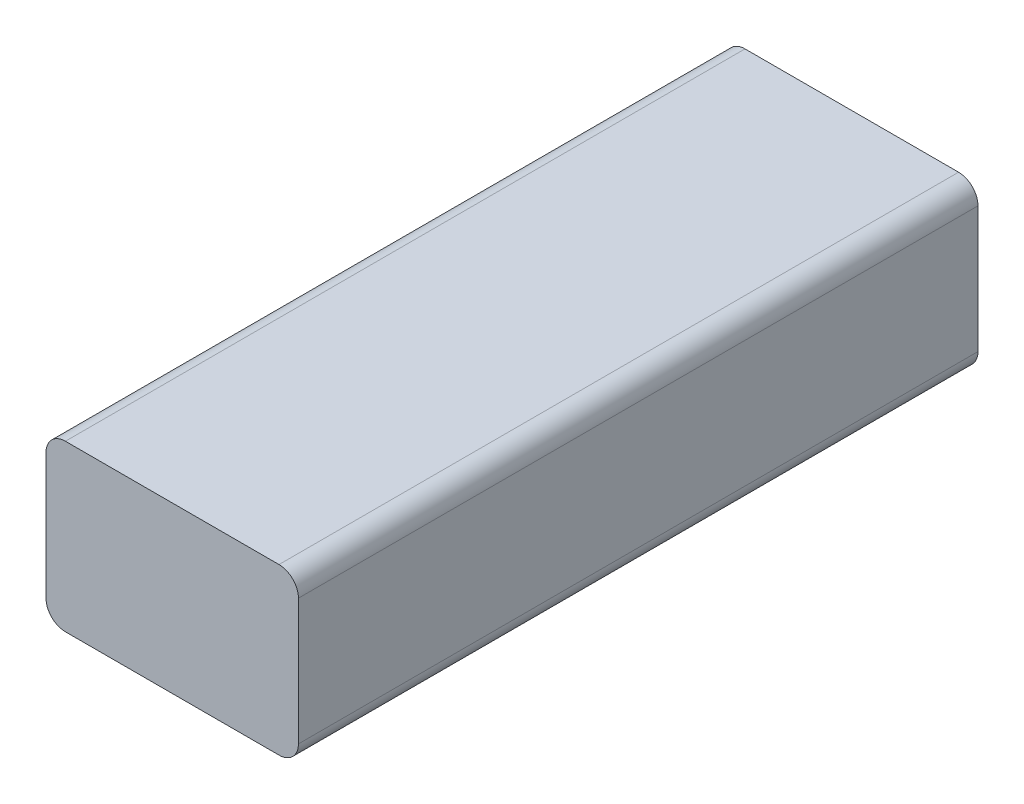
ISO-10303-21;
HEADER;
FILE_DESCRIPTION(('STEP AP214'),'2;1');
FILE_NAME('part.step','',(''),(''),'','','');
FILE_SCHEMA(('AUTOMOTIVE_DESIGN { 1 0 10303 214 1 1 1 1 }'));
ENDSEC;
DATA;
#1=APPLICATION_CONTEXT('core data for automotive mechanical design processes');
#2=APPLICATION_PROTOCOL_DEFINITION('international standard','automotive_design',2000,#1);
#3=PRODUCT_CONTEXT('',#1,'mechanical');
#4=PRODUCT('Part','Part','',(#3));
#5=PRODUCT_RELATED_PRODUCT_CATEGORY('part','',(#4));
#6=PRODUCT_DEFINITION_FORMATION('','',#4);
#7=PRODUCT_DEFINITION_CONTEXT('part definition',#1,'design');
#8=PRODUCT_DEFINITION('design','',#6,#7);
#9=PRODUCT_DEFINITION_SHAPE('','',#8);
#10=(LENGTH_UNIT() NAMED_UNIT(*) SI_UNIT(.MILLI.,.METRE.));
#11=(NAMED_UNIT(*) PLANE_ANGLE_UNIT() SI_UNIT($,.RADIAN.));
#12=(NAMED_UNIT(*) SI_UNIT($,.STERADIAN.) SOLID_ANGLE_UNIT());
#13=UNCERTAINTY_MEASURE_WITH_UNIT(LENGTH_MEASURE(1.E-05),#10,'distance_accuracy_value','');
#14=(GEOMETRIC_REPRESENTATION_CONTEXT(3) GLOBAL_UNCERTAINTY_ASSIGNED_CONTEXT((#13)) GLOBAL_UNIT_ASSIGNED_CONTEXT((#10,
#11,#12)) REPRESENTATION_CONTEXT('',''));
#15=CARTESIAN_POINT('',(0.,0.,0.));
#16=DIRECTION('',(0.,0.,1.));
#17=DIRECTION('',(1.,0.,0.));
#18=AXIS2_PLACEMENT_3D('',#15,#16,#17);
#19=CARTESIAN_POINT('',(14.6935895524748,-7.88477366255144,70.));
#20=DIRECTION('',(0.,0.,-1.));
#21=DIRECTION('',(-1.,0.,0.));
#22=AXIS2_PLACEMENT_3D('',#19,#20,#21);
#23=CYLINDRICAL_SURFACE('',#22,2.);
#24=CARTESIAN_POINT('',(14.6935895524748,-7.88477366255144,0.));
#25=DIRECTION('',(0.,0.,1.));
#26=DIRECTION('',(1.,0.,0.));
#27=AXIS2_PLACEMENT_3D('',#24,#25,#26);
#28=CIRCLE('',#27,2.);
#29=CARTESIAN_POINT('',(14.6935895524748,-9.88477366255144,0.));
#30=VERTEX_POINT('',#29);
#31=CARTESIAN_POINT('',(16.6935895524748,-7.88477366255143,0.));
#32=VERTEX_POINT('',#31);
#33=EDGE_CURVE('E132',#30,#32,#28,.T.);
#34=ORIENTED_EDGE('',*,*,#33,.T.);
#35=DIRECTION('',(0.,0.,-1.));
#36=VECTOR('',#35,1.);
#37=CARTESIAN_POINT('',(16.6935895524748,-7.88477366255143,70.));
#38=LINE('',#37,#36);
#39=CARTESIAN_POINT('',(16.6935895524748,-7.88477366255143,70.));
#40=VERTEX_POINT('',#39);
#41=EDGE_CURVE('E11',#40,#32,#38,.T.);
#42=ORIENTED_EDGE('',*,*,#41,.F.);
#43=CARTESIAN_POINT('',(14.6935895524748,-7.88477366255144,70.));
#44=DIRECTION('',(0.,0.,1.));
#45=DIRECTION('',(1.,0.,0.));
#46=AXIS2_PLACEMENT_3D('',#43,#44,#45);
#47=CIRCLE('',#46,2.);
#48=CARTESIAN_POINT('',(14.6935895524748,-9.88477366255144,70.));
#49=VERTEX_POINT('',#48);
#50=EDGE_CURVE('E146',#49,#40,#47,.T.);
#51=ORIENTED_EDGE('',*,*,#50,.F.);
#52=DIRECTION('',(0.,0.,-1.));
#53=VECTOR('',#52,1.);
#54=CARTESIAN_POINT('',(14.6935895524748,-9.88477366255144,70.));
#55=LINE('',#54,#53);
#56=EDGE_CURVE('E128',#49,#30,#55,.T.);
#57=ORIENTED_EDGE('',*,*,#56,.T.);
#58=EDGE_LOOP('',(#34,#42,#51,#57));
#59=FACE_BOUND('',#58,.T.);
#60=ADVANCED_FACE('F36',(#59),#23,.T.);
#61=CARTESIAN_POINT('',(16.6935895524748,5.11522633744855,70.));
#62=DIRECTION('',(-1.,0.,0.));
#63=DIRECTION('',(0.,-1.,0.));
#64=AXIS2_PLACEMENT_3D('',#61,#62,#63);
#65=PLANE('',#64);
#66=DIRECTION('',(0.,1.,0.));
#67=VECTOR('',#66,1.);
#68=CARTESIAN_POINT('',(16.6935895524748,5.11522633744855,0.));
#69=LINE('',#68,#67);
#70=CARTESIAN_POINT('',(16.6935895524748,5.11522633744855,0.));
#71=VERTEX_POINT('',#70);
#72=EDGE_CURVE('E135',#32,#71,#69,.T.);
#73=ORIENTED_EDGE('',*,*,#72,.T.);
#74=DIRECTION('',(0.,0.,-1.));
#75=VECTOR('',#74,1.);
#76=CARTESIAN_POINT('',(16.6935895524748,5.11522633744855,70.));
#77=LINE('',#76,#75);
#78=CARTESIAN_POINT('',(16.6935895524748,5.11522633744855,70.));
#79=VERTEX_POINT('',#78);
#80=EDGE_CURVE('E44',#79,#71,#77,.T.);
#81=ORIENTED_EDGE('',*,*,#80,.F.);
#82=DIRECTION('',(0.,1.,0.));
#83=VECTOR('',#82,1.);
#84=CARTESIAN_POINT('',(16.6935895524748,5.11522633744855,70.));
#85=LINE('',#84,#83);
#86=EDGE_CURVE('E95',#40,#79,#85,.T.);
#87=ORIENTED_EDGE('',*,*,#86,.F.);
#88=ORIENTED_EDGE('',*,*,#41,.T.);
#89=EDGE_LOOP('',(#73,#81,#87,#88));
#90=FACE_BOUND('',#89,.T.);
#91=ADVANCED_FACE('F181',(#90),#65,.F.);
#92=CARTESIAN_POINT('',(14.6935895524748,5.11522633744856,70.));
#93=DIRECTION('',(0.,0.,-1.));
#94=DIRECTION('',(-1.,0.,0.));
#95=AXIS2_PLACEMENT_3D('',#92,#93,#94);
#96=CYLINDRICAL_SURFACE('',#95,2.);
#97=CARTESIAN_POINT('',(14.6935895524748,5.11522633744856,0.));
#98=DIRECTION('',(0.,0.,1.));
#99=DIRECTION('',(-1.,0.,0.));
#100=AXIS2_PLACEMENT_3D('',#97,#98,#99);
#101=CIRCLE('',#100,2.);
#102=CARTESIAN_POINT('',(14.6935895524748,7.11522633744856,0.));
#103=VERTEX_POINT('',#102);
#104=EDGE_CURVE('E137',#71,#103,#101,.T.);
#105=ORIENTED_EDGE('',*,*,#104,.T.);
#106=DIRECTION('',(0.,0.,-1.));
#107=VECTOR('',#106,1.);
#108=CARTESIAN_POINT('',(14.6935895524748,7.11522633744856,70.));
#109=LINE('',#108,#107);
#110=CARTESIAN_POINT('',(14.6935895524748,7.11522633744856,70.));
#111=VERTEX_POINT('',#110);
#112=EDGE_CURVE('E153',#111,#103,#109,.T.);
#113=ORIENTED_EDGE('',*,*,#112,.F.);
#114=CARTESIAN_POINT('',(14.6935895524748,5.11522633744856,70.));
#115=DIRECTION('',(0.,0.,1.));
#116=DIRECTION('',(-1.,0.,0.));
#117=AXIS2_PLACEMENT_3D('',#114,#115,#116);
#118=CIRCLE('',#117,2.);
#119=EDGE_CURVE('E161',#79,#111,#118,.T.);
#120=ORIENTED_EDGE('',*,*,#119,.F.);
#121=ORIENTED_EDGE('',*,*,#80,.T.);
#122=EDGE_LOOP('',(#105,#113,#120,#121));
#123=FACE_BOUND('',#122,.T.);
#124=ADVANCED_FACE('F159',(#123),#96,.T.);
#125=CARTESIAN_POINT('',(-7.30641044752521,7.11522633744856,70.));
#126=DIRECTION('',(0.,-1.,0.));
#127=DIRECTION('',(0.,0.,-1.));
#128=AXIS2_PLACEMENT_3D('',#125,#126,#127);
#129=PLANE('',#128);
#130=DIRECTION('',(-1.,0.,0.));
#131=VECTOR('',#130,1.);
#132=CARTESIAN_POINT('',(-7.30641044752521,7.11522633744856,0.));
#133=LINE('',#132,#131);
#134=CARTESIAN_POINT('',(-7.30641044752521,7.11522633744856,0.));
#135=VERTEX_POINT('',#134);
#136=EDGE_CURVE('E139',#103,#135,#133,.T.);
#137=ORIENTED_EDGE('',*,*,#136,.T.);
#138=DIRECTION('',(0.,0.,-1.));
#139=VECTOR('',#138,1.);
#140=CARTESIAN_POINT('',(-7.30641044752521,7.11522633744856,70.));
#141=LINE('',#140,#139);
#142=CARTESIAN_POINT('',(-7.30641044752521,7.11522633744856,70.));
#143=VERTEX_POINT('',#142);
#144=EDGE_CURVE('E150',#143,#135,#141,.T.);
#145=ORIENTED_EDGE('',*,*,#144,.F.);
#146=DIRECTION('',(-1.,0.,0.));
#147=VECTOR('',#146,1.);
#148=CARTESIAN_POINT('',(-7.30641044752521,7.11522633744856,70.));
#149=LINE('',#148,#147);
#150=EDGE_CURVE('E173',#111,#143,#149,.T.);
#151=ORIENTED_EDGE('',*,*,#150,.F.);
#152=ORIENTED_EDGE('',*,*,#112,.T.);
#153=EDGE_LOOP('',(#137,#145,#151,#152));
#154=FACE_BOUND('',#153,.T.);
#155=ADVANCED_FACE('F169',(#154),#129,.F.);
#156=CARTESIAN_POINT('',(-7.30641044752522,5.11522633744856,70.));
#157=DIRECTION('',(0.,0.,-1.));
#158=DIRECTION('',(-1.,0.,0.));
#159=AXIS2_PLACEMENT_3D('',#156,#157,#158);
#160=CYLINDRICAL_SURFACE('',#159,2.);
#161=CARTESIAN_POINT('',(-7.30641044752522,5.11522633744856,0.));
#162=DIRECTION('',(0.,0.,1.));
#163=DIRECTION('',(1.,0.,0.));
#164=AXIS2_PLACEMENT_3D('',#161,#162,#163);
#165=CIRCLE('',#164,2.);
#166=CARTESIAN_POINT('',(-9.30641044752522,5.11522633744855,0.));
#167=VERTEX_POINT('',#166);
#168=EDGE_CURVE('E141',#135,#167,#165,.T.);
#169=ORIENTED_EDGE('',*,*,#168,.T.);
#170=DIRECTION('',(0.,0.,-1.));
#171=VECTOR('',#170,1.);
#172=CARTESIAN_POINT('',(-9.30641044752522,5.11522633744855,70.));
#173=LINE('',#172,#171);
#174=CARTESIAN_POINT('',(-9.30641044752522,5.11522633744855,70.));
#175=VERTEX_POINT('',#174);
#176=EDGE_CURVE('E123',#175,#167,#173,.T.);
#177=ORIENTED_EDGE('',*,*,#176,.F.);
#178=CARTESIAN_POINT('',(-7.30641044752522,5.11522633744856,70.));
#179=DIRECTION('',(0.,0.,1.));
#180=DIRECTION('',(1.,0.,0.));
#181=AXIS2_PLACEMENT_3D('',#178,#179,#180);
#182=CIRCLE('',#181,2.);
#183=EDGE_CURVE('E114',#143,#175,#182,.T.);
#184=ORIENTED_EDGE('',*,*,#183,.F.);
#185=ORIENTED_EDGE('',*,*,#144,.T.);
#186=EDGE_LOOP('',(#169,#177,#184,#185));
#187=FACE_BOUND('',#186,.T.);
#188=ADVANCED_FACE('F172',(#187),#160,.T.);
#189=CARTESIAN_POINT('',(-9.30641044752522,5.11522633744855,70.));
#190=DIRECTION('',(1.,0.,0.));
#191=DIRECTION('',(0.,1.,0.));
#192=AXIS2_PLACEMENT_3D('',#189,#190,#191);
#193=PLANE('',#192);
#194=DIRECTION('',(0.,-1.,0.));
#195=VECTOR('',#194,1.);
#196=CARTESIAN_POINT('',(-9.30641044752522,5.11522633744855,0.));
#197=LINE('',#196,#195);
#198=CARTESIAN_POINT('',(-9.30641044752523,-7.88477366255143,0.));
#199=VERTEX_POINT('',#198);
#200=EDGE_CURVE('E122',#167,#199,#197,.T.);
#201=ORIENTED_EDGE('',*,*,#200,.T.);
#202=DIRECTION('',(0.,0.,-1.));
#203=VECTOR('',#202,1.);
#204=CARTESIAN_POINT('',(-9.30641044752523,-7.88477366255143,70.));
#205=LINE('',#204,#203);
#206=CARTESIAN_POINT('',(-9.30641044752523,-7.88477366255143,70.));
#207=VERTEX_POINT('',#206);
#208=EDGE_CURVE('E119',#207,#199,#205,.T.);
#209=ORIENTED_EDGE('',*,*,#208,.F.);
#210=DIRECTION('',(0.,-1.,0.));
#211=VECTOR('',#210,1.);
#212=CARTESIAN_POINT('',(-9.30641044752522,5.11522633744855,70.));
#213=LINE('',#212,#211);
#214=EDGE_CURVE('E108',#175,#207,#213,.T.);
#215=ORIENTED_EDGE('',*,*,#214,.F.);
#216=ORIENTED_EDGE('',*,*,#176,.T.);
#217=EDGE_LOOP('',(#201,#209,#215,#216));
#218=FACE_BOUND('',#217,.T.);
#219=ADVANCED_FACE('F120',(#218),#193,.F.);
#220=CARTESIAN_POINT('',(-7.30641044752522,-7.88477366255144,70.));
#221=DIRECTION('',(0.,0.,-1.));
#222=DIRECTION('',(-1.,0.,0.));
#223=AXIS2_PLACEMENT_3D('',#220,#221,#222);
#224=CYLINDRICAL_SURFACE('',#223,2.);
#225=CARTESIAN_POINT('',(-7.30641044752522,-7.88477366255144,0.));
#226=DIRECTION('',(0.,0.,1.));
#227=DIRECTION('',(1.,0.,0.));
#228=AXIS2_PLACEMENT_3D('',#225,#226,#227);
#229=CIRCLE('',#228,2.);
#230=CARTESIAN_POINT('',(-7.30641044752521,-9.88477366255144,0.));
#231=VERTEX_POINT('',#230);
#232=EDGE_CURVE('E81',#199,#231,#229,.T.);
#233=ORIENTED_EDGE('',*,*,#232,.T.);
#234=DIRECTION('',(0.,0.,-1.));
#235=VECTOR('',#234,1.);
#236=CARTESIAN_POINT('',(-7.30641044752521,-9.88477366255144,70.));
#237=LINE('',#236,#235);
#238=CARTESIAN_POINT('',(-7.30641044752521,-9.88477366255144,70.));
#239=VERTEX_POINT('',#238);
#240=EDGE_CURVE('E124',#239,#231,#237,.T.);
#241=ORIENTED_EDGE('',*,*,#240,.F.);
#242=CARTESIAN_POINT('',(-7.30641044752522,-7.88477366255144,70.));
#243=DIRECTION('',(0.,0.,1.));
#244=DIRECTION('',(1.,0.,0.));
#245=AXIS2_PLACEMENT_3D('',#242,#243,#244);
#246=CIRCLE('',#245,2.);
#247=EDGE_CURVE('E112',#207,#239,#246,.T.);
#248=ORIENTED_EDGE('',*,*,#247,.F.);
#249=ORIENTED_EDGE('',*,*,#208,.T.);
#250=EDGE_LOOP('',(#233,#241,#248,#249));
#251=FACE_BOUND('',#250,.T.);
#252=ADVANCED_FACE('F126',(#251),#224,.T.);
#253=CARTESIAN_POINT('',(-7.30641044752521,-9.88477366255144,70.));
#254=DIRECTION('',(0.,1.,0.));
#255=DIRECTION('',(0.,0.,1.));
#256=AXIS2_PLACEMENT_3D('',#253,#254,#255);
#257=PLANE('',#256);
#258=DIRECTION('',(1.,0.,0.));
#259=VECTOR('',#258,1.);
#260=CARTESIAN_POINT('',(-7.30641044752521,-9.88477366255144,0.));
#261=LINE('',#260,#259);
#262=EDGE_CURVE('E87',#231,#30,#261,.T.);
#263=ORIENTED_EDGE('',*,*,#262,.T.);
#264=ORIENTED_EDGE('',*,*,#56,.F.);
#265=DIRECTION('',(1.,0.,0.));
#266=VECTOR('',#265,1.);
#267=CARTESIAN_POINT('',(-7.30641044752521,-9.88477366255144,70.));
#268=LINE('',#267,#266);
#269=EDGE_CURVE('E52',#239,#49,#268,.T.);
#270=ORIENTED_EDGE('',*,*,#269,.F.);
#271=ORIENTED_EDGE('',*,*,#240,.T.);
#272=EDGE_LOOP('',(#263,#264,#270,#271));
#273=FACE_BOUND('',#272,.T.);
#274=ADVANCED_FACE('F197',(#273),#257,.F.);
#275=CARTESIAN_POINT('',(14.6935895524748,-7.88477366255144,70.));
#276=DIRECTION('',(0.,0.,1.));
#277=DIRECTION('',(1.,0.,0.));
#278=AXIS2_PLACEMENT_3D('',#275,#276,#277);
#279=PLANE('',#278);
#280=ORIENTED_EDGE('',*,*,#50,.T.);
#281=ORIENTED_EDGE('',*,*,#86,.T.);
#282=ORIENTED_EDGE('',*,*,#119,.T.);
#283=ORIENTED_EDGE('',*,*,#150,.T.);
#284=ORIENTED_EDGE('',*,*,#183,.T.);
#285=ORIENTED_EDGE('',*,*,#214,.T.);
#286=ORIENTED_EDGE('',*,*,#247,.T.);
#287=ORIENTED_EDGE('',*,*,#269,.T.);
#288=EDGE_LOOP('',(#280,#281,#282,#283,#284,#285,#286,#287));
#289=FACE_BOUND('',#288,.T.);
#290=ADVANCED_FACE('F110',(#289),#279,.T.);
#291=CARTESIAN_POINT('',(14.6935895524748,-7.88477366255144,0.));
#292=DIRECTION('',(0.,0.,1.));
#293=DIRECTION('',(1.,0.,0.));
#294=AXIS2_PLACEMENT_3D('',#291,#292,#293);
#295=PLANE('',#294);
#296=ORIENTED_EDGE('',*,*,#33,.F.);
#297=ORIENTED_EDGE('',*,*,#262,.F.);
#298=ORIENTED_EDGE('',*,*,#232,.F.);
#299=ORIENTED_EDGE('',*,*,#200,.F.);
#300=ORIENTED_EDGE('',*,*,#168,.F.);
#301=ORIENTED_EDGE('',*,*,#136,.F.);
#302=ORIENTED_EDGE('',*,*,#104,.F.);
#303=ORIENTED_EDGE('',*,*,#72,.F.);
#304=EDGE_LOOP('',(#296,#297,#298,#299,#300,#301,#302,#303));
#305=FACE_BOUND('',#304,.T.);
#306=ADVANCED_FACE('F165',(#305),#295,.F.);
#307=CLOSED_SHELL('',(#60,#91,#124,#155,#188,#219,#252,#274,#290,#306));
#308=MANIFOLD_SOLID_BREP('B2',#307);
#309=ADVANCED_BREP_SHAPE_REPRESENTATION('',(#18,#308),#14);
#310=SHAPE_DEFINITION_REPRESENTATION(#9,#309);
ENDSEC;
END-ISO-10303-21;
